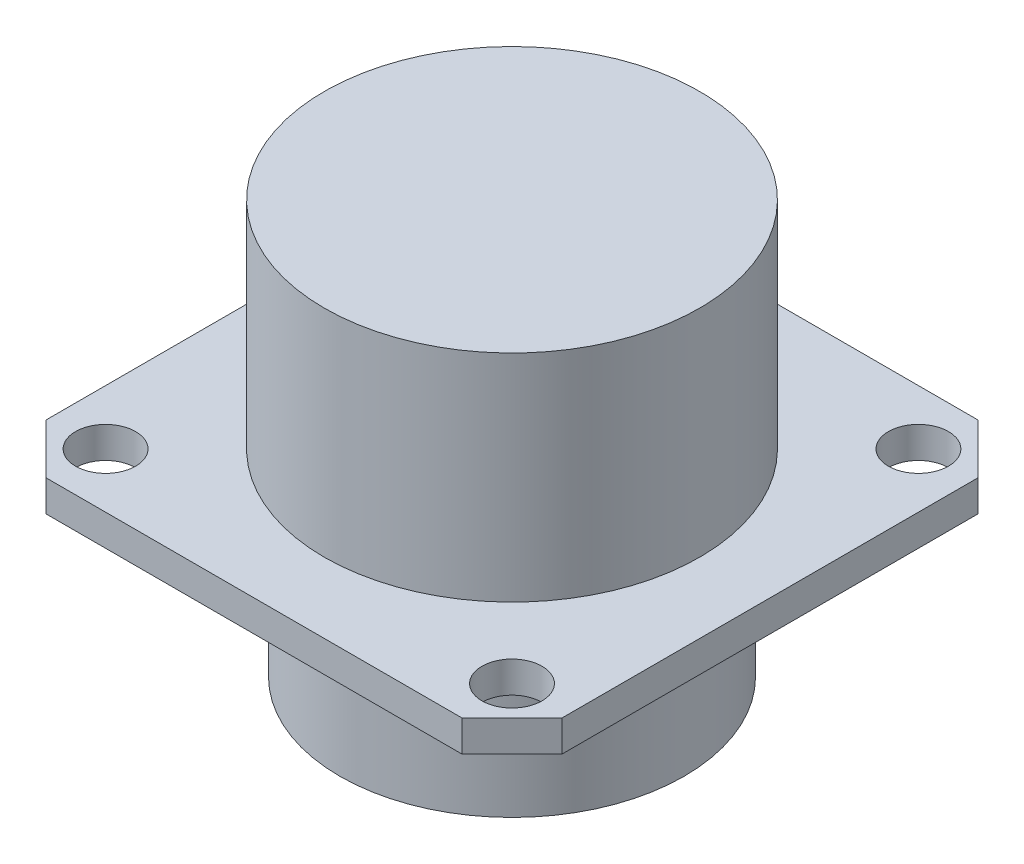
ISO-10303-21;
HEADER;
FILE_DESCRIPTION(('STEP AP214'),'2;1');
FILE_NAME('part.step','',(''),(''),'','','');
FILE_SCHEMA(('AUTOMOTIVE_DESIGN { 1 0 10303 214 1 1 1 1 }'));
ENDSEC;
DATA;
#1=APPLICATION_CONTEXT('core data for automotive mechanical design processes');
#2=APPLICATION_PROTOCOL_DEFINITION('international standard','automotive_design',2000,#1);
#3=PRODUCT_CONTEXT('',#1,'mechanical');
#4=PRODUCT('Part','Part','',(#3));
#5=PRODUCT_RELATED_PRODUCT_CATEGORY('part','',(#4));
#6=PRODUCT_DEFINITION_FORMATION('','',#4);
#7=PRODUCT_DEFINITION_CONTEXT('part definition',#1,'design');
#8=PRODUCT_DEFINITION('design','',#6,#7);
#9=PRODUCT_DEFINITION_SHAPE('','',#8);
#10=(LENGTH_UNIT() NAMED_UNIT(*) SI_UNIT(.MILLI.,.METRE.));
#11=(NAMED_UNIT(*) PLANE_ANGLE_UNIT() SI_UNIT($,.RADIAN.));
#12=(NAMED_UNIT(*) SI_UNIT($,.STERADIAN.) SOLID_ANGLE_UNIT());
#13=UNCERTAINTY_MEASURE_WITH_UNIT(LENGTH_MEASURE(1.E-05),#10,'distance_accuracy_value','');
#14=(GEOMETRIC_REPRESENTATION_CONTEXT(3) GLOBAL_UNCERTAINTY_ASSIGNED_CONTEXT((#13)) GLOBAL_UNIT_ASSIGNED_CONTEXT((#10,
#11,#12)) REPRESENTATION_CONTEXT('',''));
#15=CARTESIAN_POINT('',(0.,0.,0.));
#16=DIRECTION('',(0.,0.,1.));
#17=DIRECTION('',(1.,0.,0.));
#18=AXIS2_PLACEMENT_3D('',#15,#16,#17);
#19=CARTESIAN_POINT('',(13.0937,1.5875,-13.0937));
#20=DIRECTION('',(-1.,0.,0.));
#21=DIRECTION('',(0.,0.,1.));
#22=AXIS2_PLACEMENT_3D('',#19,#20,#21);
#23=PLANE('',#22);
#24=DIRECTION('',(0.,0.,-1.));
#25=VECTOR('',#24,1.);
#26=CARTESIAN_POINT('',(13.0937,0.,-13.0937));
#27=LINE('',#26,#25);
#28=CARTESIAN_POINT('',(13.0937,0.,10.5537));
#29=VERTEX_POINT('',#28);
#30=CARTESIAN_POINT('',(13.0937,0.,-10.5537));
#31=VERTEX_POINT('',#30);
#32=EDGE_CURVE('E129',#29,#31,#27,.T.);
#33=ORIENTED_EDGE('',*,*,#32,.T.);
#34=DIRECTION('',(0.,1.,0.));
#35=VECTOR('',#34,1.);
#36=CARTESIAN_POINT('',(13.0937,1.5875,-10.5537));
#37=LINE('',#36,#35);
#38=CARTESIAN_POINT('',(13.0937,1.5875,-10.5537));
#39=VERTEX_POINT('',#38);
#40=EDGE_CURVE('E152',#31,#39,#37,.T.);
#41=ORIENTED_EDGE('',*,*,#40,.T.);
#42=DIRECTION('',(0.,0.,-1.));
#43=VECTOR('',#42,1.);
#44=CARTESIAN_POINT('',(13.0937,1.5875,-13.0937));
#45=LINE('',#44,#43);
#46=CARTESIAN_POINT('',(13.0937,1.5875,10.5537));
#47=VERTEX_POINT('',#46);
#48=EDGE_CURVE('E127',#47,#39,#45,.T.);
#49=ORIENTED_EDGE('',*,*,#48,.F.);
#50=DIRECTION('',(0.,-1.,0.));
#51=VECTOR('',#50,1.);
#52=CARTESIAN_POINT('',(13.0937,1.5875,10.5537));
#53=LINE('',#52,#51);
#54=EDGE_CURVE('E149',#47,#29,#53,.T.);
#55=ORIENTED_EDGE('',*,*,#54,.T.);
#56=EDGE_LOOP('',(#33,#41,#49,#55));
#57=FACE_BOUND('',#56,.T.);
#58=ADVANCED_FACE('F33',(#57),#23,.F.);
#59=CARTESIAN_POINT('',(-13.0937,1.5875,-13.0937));
#60=DIRECTION('',(0.,0.,1.));
#61=DIRECTION('',(1.,0.,0.));
#62=AXIS2_PLACEMENT_3D('',#59,#60,#61);
#63=PLANE('',#62);
#64=DIRECTION('',(-1.,0.,0.));
#65=VECTOR('',#64,1.);
#66=CARTESIAN_POINT('',(-13.0937,0.,-13.0937));
#67=LINE('',#66,#65);
#68=CARTESIAN_POINT('',(10.5537,0.,-13.0937));
#69=VERTEX_POINT('',#68);
#70=CARTESIAN_POINT('',(-10.5537,0.,-13.0937));
#71=VERTEX_POINT('',#70);
#72=EDGE_CURVE('E125',#69,#71,#67,.T.);
#73=ORIENTED_EDGE('',*,*,#72,.T.);
#74=DIRECTION('',(0.,1.,0.));
#75=VECTOR('',#74,1.);
#76=CARTESIAN_POINT('',(-10.5537,1.5875,-13.0937));
#77=LINE('',#76,#75);
#78=CARTESIAN_POINT('',(-10.5537,1.5875,-13.0937));
#79=VERTEX_POINT('',#78);
#80=EDGE_CURVE('E104',#71,#79,#77,.T.);
#81=ORIENTED_EDGE('',*,*,#80,.T.);
#82=DIRECTION('',(-1.,0.,0.));
#83=VECTOR('',#82,1.);
#84=CARTESIAN_POINT('',(-13.0937,1.5875,-13.0937));
#85=LINE('',#84,#83);
#86=CARTESIAN_POINT('',(10.5537,1.5875,-13.0937));
#87=VERTEX_POINT('',#86);
#88=EDGE_CURVE('E170',#87,#79,#85,.T.);
#89=ORIENTED_EDGE('',*,*,#88,.F.);
#90=DIRECTION('',(0.,-1.,0.));
#91=VECTOR('',#90,1.);
#92=CARTESIAN_POINT('',(10.5537,1.5875,-13.0937));
#93=LINE('',#92,#91);
#94=EDGE_CURVE('E109',#87,#69,#93,.T.);
#95=ORIENTED_EDGE('',*,*,#94,.T.);
#96=EDGE_LOOP('',(#73,#81,#89,#95));
#97=FACE_BOUND('',#96,.T.);
#98=ADVANCED_FACE('F248',(#97),#63,.F.);
#99=CARTESIAN_POINT('',(-13.0937,1.5875,-13.0937));
#100=DIRECTION('',(1.,0.,0.));
#101=DIRECTION('',(0.,0.,-1.));
#102=AXIS2_PLACEMENT_3D('',#99,#100,#101);
#103=PLANE('',#102);
#104=DIRECTION('',(0.,0.,1.));
#105=VECTOR('',#104,1.);
#106=CARTESIAN_POINT('',(-13.0937,1.5875,-13.0937));
#107=LINE('',#106,#105);
#108=CARTESIAN_POINT('',(-13.0937,1.5875,-10.5537));
#109=VERTEX_POINT('',#108);
#110=CARTESIAN_POINT('',(-13.0937,1.5875,10.5537));
#111=VERTEX_POINT('',#110);
#112=EDGE_CURVE('E118',#109,#111,#107,.T.);
#113=ORIENTED_EDGE('',*,*,#112,.F.);
#114=DIRECTION('',(0.,-1.,0.));
#115=VECTOR('',#114,1.);
#116=CARTESIAN_POINT('',(-13.0937,1.5875,-10.5537));
#117=LINE('',#116,#115);
#118=CARTESIAN_POINT('',(-13.0937,0.,-10.5537));
#119=VERTEX_POINT('',#118);
#120=EDGE_CURVE('E103',#109,#119,#117,.T.);
#121=ORIENTED_EDGE('',*,*,#120,.T.);
#122=DIRECTION('',(0.,0.,1.));
#123=VECTOR('',#122,1.);
#124=CARTESIAN_POINT('',(-13.0937,0.,-13.0937));
#125=LINE('',#124,#123);
#126=CARTESIAN_POINT('',(-13.0937,0.,10.5537));
#127=VERTEX_POINT('',#126);
#128=EDGE_CURVE('E116',#119,#127,#125,.T.);
#129=ORIENTED_EDGE('',*,*,#128,.T.);
#130=DIRECTION('',(0.,1.,0.));
#131=VECTOR('',#130,1.);
#132=CARTESIAN_POINT('',(-13.0937,1.5875,10.5537));
#133=LINE('',#132,#131);
#134=EDGE_CURVE('E120',#127,#111,#133,.T.);
#135=ORIENTED_EDGE('',*,*,#134,.T.);
#136=EDGE_LOOP('',(#113,#121,#129,#135));
#137=FACE_BOUND('',#136,.T.);
#138=ADVANCED_FACE('F115',(#137),#103,.F.);
#139=CARTESIAN_POINT('',(-13.0937,1.5875,13.0937));
#140=DIRECTION('',(0.,0.,-1.));
#141=DIRECTION('',(-1.,0.,0.));
#142=AXIS2_PLACEMENT_3D('',#139,#140,#141);
#143=PLANE('',#142);
#144=DIRECTION('',(1.,0.,0.));
#145=VECTOR('',#144,1.);
#146=CARTESIAN_POINT('',(-13.0937,0.,13.0937));
#147=LINE('',#146,#145);
#148=CARTESIAN_POINT('',(-10.5537,0.,13.0937));
#149=VERTEX_POINT('',#148);
#150=CARTESIAN_POINT('',(10.5537,0.,13.0937));
#151=VERTEX_POINT('',#150);
#152=EDGE_CURVE('E124',#149,#151,#147,.T.);
#153=ORIENTED_EDGE('',*,*,#152,.T.);
#154=DIRECTION('',(0.,1.,0.));
#155=VECTOR('',#154,1.);
#156=CARTESIAN_POINT('',(10.5537,1.5875,13.0937));
#157=LINE('',#156,#155);
#158=CARTESIAN_POINT('',(10.5537,1.5875,13.0937));
#159=VERTEX_POINT('',#158);
#160=EDGE_CURVE('E41',#151,#159,#157,.T.);
#161=ORIENTED_EDGE('',*,*,#160,.T.);
#162=DIRECTION('',(1.,0.,0.));
#163=VECTOR('',#162,1.);
#164=CARTESIAN_POINT('',(-13.0937,1.5875,13.0937));
#165=LINE('',#164,#163);
#166=CARTESIAN_POINT('',(-10.5537,1.5875,13.0937));
#167=VERTEX_POINT('',#166);
#168=EDGE_CURVE('E133',#167,#159,#165,.T.);
#169=ORIENTED_EDGE('',*,*,#168,.F.);
#170=DIRECTION('',(0.,-1.,0.));
#171=VECTOR('',#170,1.);
#172=CARTESIAN_POINT('',(-10.5537,1.5875,13.0937));
#173=LINE('',#172,#171);
#174=EDGE_CURVE('E154',#167,#149,#173,.T.);
#175=ORIENTED_EDGE('',*,*,#174,.T.);
#176=EDGE_LOOP('',(#153,#161,#169,#175));
#177=FACE_BOUND('',#176,.T.);
#178=ADVANCED_FACE('F157',(#177),#143,.F.);
#179=CARTESIAN_POINT('',(0.,1.5875,0.));
#180=DIRECTION('',(0.,1.,0.));
#181=DIRECTION('',(0.,0.,1.));
#182=AXIS2_PLACEMENT_3D('',#179,#180,#181);
#183=PLANE('',#182);
#184=CARTESIAN_POINT('',(0.,1.5875,0.));
#185=DIRECTION('',(0.,1.,0.));
#186=DIRECTION('',(0.,0.,1.));
#187=AXIS2_PLACEMENT_3D('',#184,#185,#186);
#188=CIRCLE('',#187,9.525);
#189=CARTESIAN_POINT('',(0.,1.5875,9.525));
#190=VERTEX_POINT('',#189);
#191=EDGE_CURVE('E204',#190,#190,#188,.T.);
#192=ORIENTED_EDGE('',*,*,#191,.F.);
#193=EDGE_LOOP('',(#192));
#194=FACE_BOUND('',#193,.T.);
#195=CARTESIAN_POINT('',(10.3124,1.5875,-10.3124));
#196=DIRECTION('',(0.,1.,0.));
#197=DIRECTION('',(0.,0.,1.));
#198=AXIS2_PLACEMENT_3D('',#195,#196,#197);
#199=CIRCLE('',#198,1.524);
#200=CARTESIAN_POINT('',(10.3124,1.5875,-8.7884));
#201=VERTEX_POINT('',#200);
#202=EDGE_CURVE('E199',#201,#201,#199,.T.);
#203=ORIENTED_EDGE('',*,*,#202,.F.);
#204=EDGE_LOOP('',(#203));
#205=FACE_BOUND('',#204,.T.);
#206=CARTESIAN_POINT('',(10.3124,1.5875,10.3124));
#207=DIRECTION('',(0.,1.,0.));
#208=DIRECTION('',(0.,0.,1.));
#209=AXIS2_PLACEMENT_3D('',#206,#207,#208);
#210=CIRCLE('',#209,1.524);
#211=CARTESIAN_POINT('',(10.3124,1.5875,11.8364));
#212=VERTEX_POINT('',#211);
#213=EDGE_CURVE('E193',#212,#212,#210,.T.);
#214=ORIENTED_EDGE('',*,*,#213,.F.);
#215=EDGE_LOOP('',(#214));
#216=FACE_BOUND('',#215,.T.);
#217=CARTESIAN_POINT('',(-10.3124,1.5875,10.3124));
#218=DIRECTION('',(0.,1.,0.));
#219=DIRECTION('',(0.,0.,1.));
#220=AXIS2_PLACEMENT_3D('',#217,#218,#219);
#221=CIRCLE('',#220,1.524);
#222=CARTESIAN_POINT('',(-10.3124,1.5875,11.8364));
#223=VERTEX_POINT('',#222);
#224=EDGE_CURVE('E186',#223,#223,#221,.T.);
#225=ORIENTED_EDGE('',*,*,#224,.F.);
#226=EDGE_LOOP('',(#225));
#227=FACE_BOUND('',#226,.T.);
#228=CARTESIAN_POINT('',(-10.3124,1.5875,-10.3124));
#229=DIRECTION('',(0.,1.,0.));
#230=DIRECTION('',(0.,0.,1.));
#231=AXIS2_PLACEMENT_3D('',#228,#229,#230);
#232=CIRCLE('',#231,1.524);
#233=CARTESIAN_POINT('',(-10.3124,1.5875,-8.7884));
#234=VERTEX_POINT('',#233);
#235=EDGE_CURVE('E175',#234,#234,#232,.T.);
#236=ORIENTED_EDGE('',*,*,#235,.F.);
#237=EDGE_LOOP('',(#236));
#238=FACE_BOUND('',#237,.T.);
#239=ORIENTED_EDGE('',*,*,#88,.T.);
#240=DIRECTION('',(0.707106781186549,0.,-0.707106781186546));
#241=VECTOR('',#240,1.);
#242=CARTESIAN_POINT('',(-11.8237,1.5875,-11.8237));
#243=LINE('',#242,#241);
#244=EDGE_CURVE('E147',#79,#109,#243,.F.);
#245=ORIENTED_EDGE('',*,*,#244,.T.);
#246=ORIENTED_EDGE('',*,*,#112,.T.);
#247=DIRECTION('',(-0.707106781186546,0.,-0.707106781186549));
#248=VECTOR('',#247,1.);
#249=CARTESIAN_POINT('',(-11.8237,1.5875,11.8237));
#250=LINE('',#249,#248);
#251=EDGE_CURVE('E54',#111,#167,#250,.F.);
#252=ORIENTED_EDGE('',*,*,#251,.T.);
#253=ORIENTED_EDGE('',*,*,#168,.T.);
#254=DIRECTION('',(-0.707106781186549,0.,0.707106781186546));
#255=VECTOR('',#254,1.);
#256=CARTESIAN_POINT('',(11.8237,1.5875,11.8237));
#257=LINE('',#256,#255);
#258=EDGE_CURVE('E143',#159,#47,#257,.F.);
#259=ORIENTED_EDGE('',*,*,#258,.T.);
#260=ORIENTED_EDGE('',*,*,#48,.T.);
#261=DIRECTION('',(0.707106781186546,0.,0.707106781186549));
#262=VECTOR('',#261,1.);
#263=CARTESIAN_POINT('',(11.8237,1.5875,-11.8237));
#264=LINE('',#263,#262);
#265=EDGE_CURVE('E145',#39,#87,#264,.F.);
#266=ORIENTED_EDGE('',*,*,#265,.T.);
#267=EDGE_LOOP('',(#239,#245,#246,#252,#253,#259,#260,#266));
#268=FACE_BOUND('',#267,.T.);
#269=ADVANCED_FACE('F224',(#194,#205,#216,#227,#238,#268),#183,.T.);
#270=CARTESIAN_POINT('',(0.,0.,0.));
#271=DIRECTION('',(0.,1.,0.));
#272=DIRECTION('',(0.,0.,1.));
#273=AXIS2_PLACEMENT_3D('',#270,#271,#272);
#274=PLANE('',#273);
#275=CARTESIAN_POINT('',(0.,0.,0.));
#276=DIRECTION('',(0.,1.,0.));
#277=DIRECTION('',(0.,0.,1.));
#278=AXIS2_PLACEMENT_3D('',#275,#276,#277);
#279=CIRCLE('',#278,8.7376);
#280=CARTESIAN_POINT('',(0.,0.,8.7376));
#281=VERTEX_POINT('',#280);
#282=EDGE_CURVE('E11',#281,#281,#279,.F.);
#283=ORIENTED_EDGE('',*,*,#282,.F.);
#284=EDGE_LOOP('',(#283));
#285=FACE_BOUND('',#284,.T.);
#286=CARTESIAN_POINT('',(10.3124,0.,-10.3124));
#287=DIRECTION('',(0.,1.,0.));
#288=DIRECTION('',(0.,0.,1.));
#289=AXIS2_PLACEMENT_3D('',#286,#287,#288);
#290=CIRCLE('',#289,1.524);
#291=CARTESIAN_POINT('',(10.3124,0.,-8.7884));
#292=VERTEX_POINT('',#291);
#293=EDGE_CURVE('E184',#292,#292,#290,.T.);
#294=ORIENTED_EDGE('',*,*,#293,.T.);
#295=EDGE_LOOP('',(#294));
#296=FACE_BOUND('',#295,.T.);
#297=CARTESIAN_POINT('',(10.3124,0.,10.3124));
#298=DIRECTION('',(0.,1.,0.));
#299=DIRECTION('',(0.,0.,1.));
#300=AXIS2_PLACEMENT_3D('',#297,#298,#299);
#301=CIRCLE('',#300,1.524);
#302=CARTESIAN_POINT('',(10.3124,0.,11.8364));
#303=VERTEX_POINT('',#302);
#304=EDGE_CURVE('E196',#303,#303,#301,.T.);
#305=ORIENTED_EDGE('',*,*,#304,.T.);
#306=EDGE_LOOP('',(#305));
#307=FACE_BOUND('',#306,.T.);
#308=CARTESIAN_POINT('',(-10.3124,0.,10.3124));
#309=DIRECTION('',(0.,1.,0.));
#310=DIRECTION('',(0.,0.,1.));
#311=AXIS2_PLACEMENT_3D('',#308,#309,#310);
#312=CIRCLE('',#311,1.524);
#313=CARTESIAN_POINT('',(-10.3124,0.,11.8364));
#314=VERTEX_POINT('',#313);
#315=EDGE_CURVE('E189',#314,#314,#312,.T.);
#316=ORIENTED_EDGE('',*,*,#315,.T.);
#317=EDGE_LOOP('',(#316));
#318=FACE_BOUND('',#317,.T.);
#319=CARTESIAN_POINT('',(-10.3124,0.,-10.3124));
#320=DIRECTION('',(0.,1.,0.));
#321=DIRECTION('',(0.,0.,1.));
#322=AXIS2_PLACEMENT_3D('',#319,#320,#321);
#323=CIRCLE('',#322,1.524);
#324=CARTESIAN_POINT('',(-10.3124,0.,-8.7884));
#325=VERTEX_POINT('',#324);
#326=EDGE_CURVE('E179',#325,#325,#323,.T.);
#327=ORIENTED_EDGE('',*,*,#326,.T.);
#328=EDGE_LOOP('',(#327));
#329=FACE_BOUND('',#328,.T.);
#330=ORIENTED_EDGE('',*,*,#128,.F.);
#331=DIRECTION('',(-0.707106781186549,0.,0.707106781186546));
#332=VECTOR('',#331,1.);
#333=CARTESIAN_POINT('',(-13.0937,0.,-10.5537));
#334=LINE('',#333,#332);
#335=EDGE_CURVE('E99',#119,#71,#334,.F.);
#336=ORIENTED_EDGE('',*,*,#335,.T.);
#337=ORIENTED_EDGE('',*,*,#72,.F.);
#338=DIRECTION('',(-0.707106781186546,0.,-0.707106781186549));
#339=VECTOR('',#338,1.);
#340=CARTESIAN_POINT('',(10.5537,0.,-13.0937));
#341=LINE('',#340,#339);
#342=EDGE_CURVE('E110',#69,#31,#341,.F.);
#343=ORIENTED_EDGE('',*,*,#342,.T.);
#344=ORIENTED_EDGE('',*,*,#32,.F.);
#345=DIRECTION('',(0.707106781186549,0.,-0.707106781186546));
#346=VECTOR('',#345,1.);
#347=CARTESIAN_POINT('',(13.0937,0.,10.5537));
#348=LINE('',#347,#346);
#349=EDGE_CURVE('E136',#29,#151,#348,.F.);
#350=ORIENTED_EDGE('',*,*,#349,.T.);
#351=ORIENTED_EDGE('',*,*,#152,.F.);
#352=DIRECTION('',(0.707106781186546,0.,0.707106781186549));
#353=VECTOR('',#352,1.);
#354=CARTESIAN_POINT('',(-10.5537,0.,13.0937));
#355=LINE('',#354,#353);
#356=EDGE_CURVE('E119',#149,#127,#355,.F.);
#357=ORIENTED_EDGE('',*,*,#356,.T.);
#358=EDGE_LOOP('',(#330,#336,#337,#343,#344,#350,#351,#357));
#359=FACE_BOUND('',#358,.T.);
#360=ADVANCED_FACE('F122',(#285,#296,#307,#318,#329,#359),#274,.F.);
#361=CARTESIAN_POINT('',(-13.0937,1.5875,-10.5537));
#362=DIRECTION('',(0.707106781186546,0.,0.707106781186549));
#363=DIRECTION('',(0.,-1.,0.));
#364=AXIS2_PLACEMENT_3D('',#361,#362,#363);
#365=PLANE('',#364);
#366=ORIENTED_EDGE('',*,*,#244,.F.);
#367=ORIENTED_EDGE('',*,*,#80,.F.);
#368=ORIENTED_EDGE('',*,*,#335,.F.);
#369=ORIENTED_EDGE('',*,*,#120,.F.);
#370=EDGE_LOOP('',(#366,#367,#368,#369));
#371=FACE_BOUND('',#370,.T.);
#372=ADVANCED_FACE('F102',(#371),#365,.F.);
#373=CARTESIAN_POINT('',(10.5537,1.5875,-13.0937));
#374=DIRECTION('',(-0.707106781186549,0.,0.707106781186546));
#375=DIRECTION('',(0.,-1.,0.));
#376=AXIS2_PLACEMENT_3D('',#373,#374,#375);
#377=PLANE('',#376);
#378=ORIENTED_EDGE('',*,*,#265,.F.);
#379=ORIENTED_EDGE('',*,*,#40,.F.);
#380=ORIENTED_EDGE('',*,*,#342,.F.);
#381=ORIENTED_EDGE('',*,*,#94,.F.);
#382=EDGE_LOOP('',(#378,#379,#380,#381));
#383=FACE_BOUND('',#382,.T.);
#384=ADVANCED_FACE('F250',(#383),#377,.F.);
#385=CARTESIAN_POINT('',(13.0937,1.5875,10.5537));
#386=DIRECTION('',(-0.707106781186546,0.,-0.707106781186549));
#387=DIRECTION('',(0.,-1.,0.));
#388=AXIS2_PLACEMENT_3D('',#385,#386,#387);
#389=PLANE('',#388);
#390=ORIENTED_EDGE('',*,*,#258,.F.);
#391=ORIENTED_EDGE('',*,*,#160,.F.);
#392=ORIENTED_EDGE('',*,*,#349,.F.);
#393=ORIENTED_EDGE('',*,*,#54,.F.);
#394=EDGE_LOOP('',(#390,#391,#392,#393));
#395=FACE_BOUND('',#394,.T.);
#396=ADVANCED_FACE('F164',(#395),#389,.F.);
#397=CARTESIAN_POINT('',(-10.5537,1.5875,13.0937));
#398=DIRECTION('',(0.707106781186549,0.,-0.707106781186546));
#399=DIRECTION('',(0.,-1.,0.));
#400=AXIS2_PLACEMENT_3D('',#397,#398,#399);
#401=PLANE('',#400);
#402=ORIENTED_EDGE('',*,*,#251,.F.);
#403=ORIENTED_EDGE('',*,*,#134,.F.);
#404=ORIENTED_EDGE('',*,*,#356,.F.);
#405=ORIENTED_EDGE('',*,*,#174,.F.);
#406=EDGE_LOOP('',(#402,#403,#404,#405));
#407=FACE_BOUND('',#406,.T.);
#408=ADVANCED_FACE('F35',(#407),#401,.F.);
#409=CARTESIAN_POINT('',(-10.3124,0.,-10.3124));
#410=DIRECTION('',(0.,1.,0.));
#411=DIRECTION('',(0.,0.,1.));
#412=AXIS2_PLACEMENT_3D('',#409,#410,#411);
#413=CYLINDRICAL_SURFACE('',#412,1.524);
#414=ORIENTED_EDGE('',*,*,#326,.F.);
#415=EDGE_LOOP('',(#414));
#416=FACE_BOUND('',#415,.T.);
#417=ORIENTED_EDGE('',*,*,#235,.T.);
#418=EDGE_LOOP('',(#417));
#419=FACE_BOUND('',#418,.T.);
#420=ADVANCED_FACE('F236',(#416,#419),#413,.F.);
#421=CARTESIAN_POINT('',(-10.3124,0.,10.3124));
#422=DIRECTION('',(0.,1.,0.));
#423=DIRECTION('',(0.,0.,1.));
#424=AXIS2_PLACEMENT_3D('',#421,#422,#423);
#425=CYLINDRICAL_SURFACE('',#424,1.524);
#426=ORIENTED_EDGE('',*,*,#315,.F.);
#427=EDGE_LOOP('',(#426));
#428=FACE_BOUND('',#427,.T.);
#429=ORIENTED_EDGE('',*,*,#224,.T.);
#430=EDGE_LOOP('',(#429));
#431=FACE_BOUND('',#430,.T.);
#432=ADVANCED_FACE('F232',(#428,#431),#425,.F.);
#433=CARTESIAN_POINT('',(10.3124,0.,10.3124));
#434=DIRECTION('',(0.,1.,0.));
#435=DIRECTION('',(0.,0.,1.));
#436=AXIS2_PLACEMENT_3D('',#433,#434,#435);
#437=CYLINDRICAL_SURFACE('',#436,1.524);
#438=ORIENTED_EDGE('',*,*,#304,.F.);
#439=EDGE_LOOP('',(#438));
#440=FACE_BOUND('',#439,.T.);
#441=ORIENTED_EDGE('',*,*,#213,.T.);
#442=EDGE_LOOP('',(#441));
#443=FACE_BOUND('',#442,.T.);
#444=ADVANCED_FACE('F235',(#440,#443),#437,.F.);
#445=CARTESIAN_POINT('',(10.3124,0.,-10.3124));
#446=DIRECTION('',(0.,1.,0.));
#447=DIRECTION('',(0.,0.,1.));
#448=AXIS2_PLACEMENT_3D('',#445,#446,#447);
#449=CYLINDRICAL_SURFACE('',#448,1.524);
#450=ORIENTED_EDGE('',*,*,#293,.F.);
#451=EDGE_LOOP('',(#450));
#452=FACE_BOUND('',#451,.T.);
#453=ORIENTED_EDGE('',*,*,#202,.T.);
#454=EDGE_LOOP('',(#453));
#455=FACE_BOUND('',#454,.T.);
#456=ADVANCED_FACE('F274',(#452,#455),#449,.F.);
#457=CARTESIAN_POINT('',(0.,12.5349,0.));
#458=DIRECTION('',(0.,-1.,0.));
#459=DIRECTION('',(0.,0.,-1.));
#460=AXIS2_PLACEMENT_3D('',#457,#458,#459);
#461=CYLINDRICAL_SURFACE('',#460,9.525);
#462=CARTESIAN_POINT('',(0.,12.5349,0.));
#463=DIRECTION('',(0.,1.,0.));
#464=DIRECTION('',(0.,0.,1.));
#465=AXIS2_PLACEMENT_3D('',#462,#463,#464);
#466=CIRCLE('',#465,9.525);
#467=CARTESIAN_POINT('',(0.,12.5349,9.525));
#468=VERTEX_POINT('',#467);
#469=EDGE_CURVE('E190',#468,#468,#466,.T.);
#470=ORIENTED_EDGE('',*,*,#469,.F.);
#471=EDGE_LOOP('',(#470));
#472=FACE_BOUND('',#471,.T.);
#473=ORIENTED_EDGE('',*,*,#191,.T.);
#474=EDGE_LOOP('',(#473));
#475=FACE_BOUND('',#474,.T.);
#476=ADVANCED_FACE('F278',(#472,#475),#461,.T.);
#477=CARTESIAN_POINT('',(0.,12.5349,0.));
#478=DIRECTION('',(0.,1.,0.));
#479=DIRECTION('',(0.,0.,1.));
#480=AXIS2_PLACEMENT_3D('',#477,#478,#479);
#481=PLANE('',#480);
#482=ORIENTED_EDGE('',*,*,#469,.T.);
#483=EDGE_LOOP('',(#482));
#484=FACE_BOUND('',#483,.T.);
#485=ADVANCED_FACE('F218',(#484),#481,.T.);
#486=CARTESIAN_POINT('',(0.,-8.4328,0.));
#487=DIRECTION('',(0.,1.,0.));
#488=DIRECTION('',(0.,0.,1.));
#489=AXIS2_PLACEMENT_3D('',#486,#487,#488);
#490=CYLINDRICAL_SURFACE('',#489,8.7376);
#491=CARTESIAN_POINT('',(0.,-8.4328,0.));
#492=DIRECTION('',(0.,-1.,0.));
#493=DIRECTION('',(0.,0.,-1.));
#494=AXIS2_PLACEMENT_3D('',#491,#492,#493);
#495=CIRCLE('',#494,8.7376);
#496=CARTESIAN_POINT('',(0.,-8.4328,-8.7376));
#497=VERTEX_POINT('',#496);
#498=EDGE_CURVE('E207',#497,#497,#495,.T.);
#499=ORIENTED_EDGE('',*,*,#498,.F.);
#500=EDGE_LOOP('',(#499));
#501=FACE_BOUND('',#500,.T.);
#502=ORIENTED_EDGE('',*,*,#282,.T.);
#503=EDGE_LOOP('',(#502));
#504=FACE_BOUND('',#503,.T.);
#505=ADVANCED_FACE('F215',(#501,#504),#490,.T.);
#506=CARTESIAN_POINT('',(0.,-8.4328,0.));
#507=DIRECTION('',(0.,-1.,0.));
#508=DIRECTION('',(0.,0.,-1.));
#509=AXIS2_PLACEMENT_3D('',#506,#507,#508);
#510=PLANE('',#509);
#511=ORIENTED_EDGE('',*,*,#498,.T.);
#512=EDGE_LOOP('',(#511));
#513=FACE_BOUND('',#512,.T.);
#514=ADVANCED_FACE('F213',(#513),#510,.T.);
#515=CLOSED_SHELL('',(#58,#98,#138,#178,#269,#360,#372,#384,#396,#408,#420,#432,#444,#456,#476,
#485,#505,#514));
#516=MANIFOLD_SOLID_BREP('B2',#515);
#517=ADVANCED_BREP_SHAPE_REPRESENTATION('',(#18,#516),#14);
#518=SHAPE_DEFINITION_REPRESENTATION(#9,#517);
ENDSEC;
END-ISO-10303-21;
